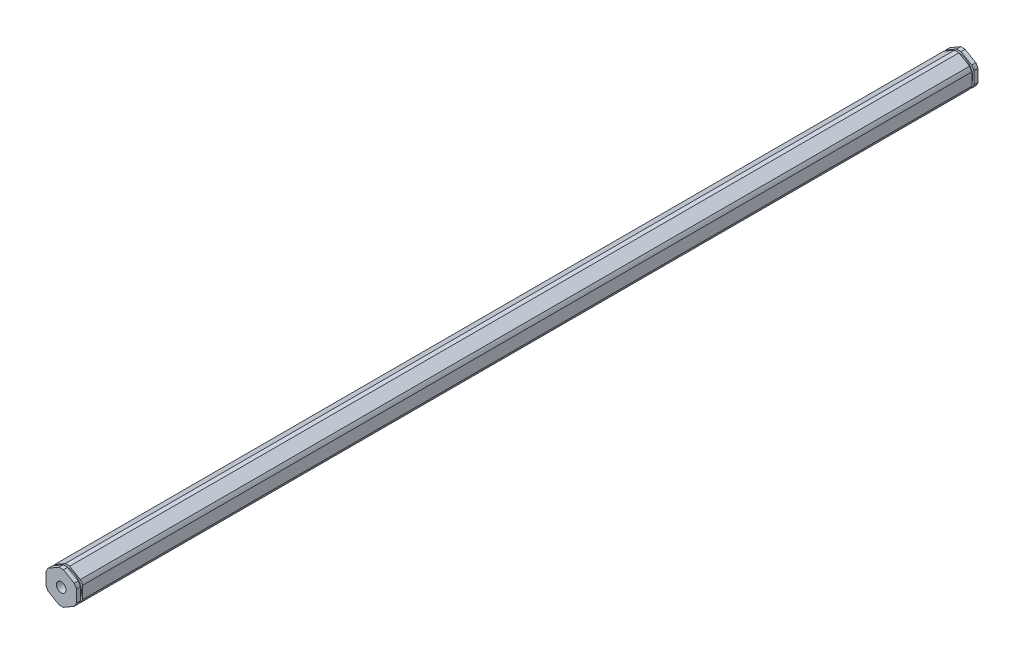
ISO-10303-21;
HEADER;
FILE_DESCRIPTION(('STEP AP214'),'2;1');
FILE_NAME('part.step','',(''),(''),'','','');
FILE_SCHEMA(('AUTOMOTIVE_DESIGN { 1 0 10303 214 1 1 1 1 }'));
ENDSEC;
DATA;
#1=APPLICATION_CONTEXT('core data for automotive mechanical design processes');
#2=APPLICATION_PROTOCOL_DEFINITION('international standard','automotive_design',2000,#1);
#3=PRODUCT_CONTEXT('',#1,'mechanical');
#4=PRODUCT('Part','Part','',(#3));
#5=PRODUCT_RELATED_PRODUCT_CATEGORY('part','',(#4));
#6=PRODUCT_DEFINITION_FORMATION('','',#4);
#7=PRODUCT_DEFINITION_CONTEXT('part definition',#1,'design');
#8=PRODUCT_DEFINITION('design','',#6,#7);
#9=PRODUCT_DEFINITION_SHAPE('','',#8);
#10=(LENGTH_UNIT() NAMED_UNIT(*) SI_UNIT(.MILLI.,.METRE.));
#11=(NAMED_UNIT(*) PLANE_ANGLE_UNIT() SI_UNIT($,.RADIAN.));
#12=(NAMED_UNIT(*) SI_UNIT($,.STERADIAN.) SOLID_ANGLE_UNIT());
#13=UNCERTAINTY_MEASURE_WITH_UNIT(LENGTH_MEASURE(1.E-05),#10,'distance_accuracy_value','');
#14=(GEOMETRIC_REPRESENTATION_CONTEXT(3) GLOBAL_UNCERTAINTY_ASSIGNED_CONTEXT((#13)) GLOBAL_UNIT_ASSIGNED_CONTEXT((#10,
#11,#12)) REPRESENTATION_CONTEXT('',''));
#15=CARTESIAN_POINT('',(0.,0.,0.));
#16=DIRECTION('',(0.,0.,1.));
#17=DIRECTION('',(1.,0.,0.));
#18=AXIS2_PLACEMENT_3D('',#15,#16,#17);
#19=CARTESIAN_POINT('',(0.,0.,188.4045));
#20=DIRECTION('',(0.,0.,-1.));
#21=DIRECTION('',(-1.,0.,0.));
#22=AXIS2_PLACEMENT_3D('',#19,#20,#21);
#23=CYLINDRICAL_SURFACE('',#22,6.858);
#24=CARTESIAN_POINT('',(0.,0.,-185.801));
#25=DIRECTION('',(0.,0.,1.));
#26=DIRECTION('',(1.,0.,0.));
#27=AXIS2_PLACEMENT_3D('',#24,#25,#26);
#28=CIRCLE('',#27,6.858);
#29=CARTESIAN_POINT('',(5.41826726004728,-4.20411035757861,-185.801));
#30=VERTEX_POINT('',#29);
#31=CARTESIAN_POINT('',(6.35,-2.59030191290513,-185.801));
#32=VERTEX_POINT('',#31);
#33=EDGE_CURVE('E309',#30,#32,#28,.T.);
#34=ORIENTED_EDGE('',*,*,#33,.T.);
#35=DIRECTION('',(0.,0.,-1.));
#36=VECTOR('',#35,1.);
#37=CARTESIAN_POINT('',(6.35,-2.59030191290513,188.4045));
#38=LINE('',#37,#36);
#39=CARTESIAN_POINT('',(6.35,-2.59030191290513,185.801));
#40=VERTEX_POINT('',#39);
#41=EDGE_CURVE('E351',#40,#32,#38,.T.);
#42=ORIENTED_EDGE('',*,*,#41,.F.);
#43=CARTESIAN_POINT('',(0.,0.,185.801));
#44=DIRECTION('',(0.,0.,1.));
#45=DIRECTION('',(1.,0.,0.));
#46=AXIS2_PLACEMENT_3D('',#43,#44,#45);
#47=CIRCLE('',#46,6.858);
#48=CARTESIAN_POINT('',(5.41826726004727,-4.20411035757862,185.801));
#49=VERTEX_POINT('',#48);
#50=EDGE_CURVE('E330',#49,#40,#47,.T.);
#51=ORIENTED_EDGE('',*,*,#50,.F.);
#52=DIRECTION('',(0.,0.,-1.));
#53=VECTOR('',#52,1.);
#54=CARTESIAN_POINT('',(5.41826726004727,-4.20411035757862,188.4045));
#55=LINE('',#54,#53);
#56=EDGE_CURVE('E353',#49,#30,#55,.T.);
#57=ORIENTED_EDGE('',*,*,#56,.T.);
#58=EDGE_LOOP('',(#34,#42,#51,#57));
#59=FACE_BOUND('',#58,.T.);
#60=ADVANCED_FACE('F58',(#59),#23,.T.);
#61=CARTESIAN_POINT('',(3.175,-5.49926131403118,188.4045));
#62=DIRECTION('',(-0.5,0.866025403784438,0.));
#63=DIRECTION('',(-0.866025403784439,-0.5,0.));
#64=AXIS2_PLACEMENT_3D('',#61,#62,#63);
#65=PLANE('',#64);
#66=DIRECTION('',(-0.866025403784439,-0.5,0.));
#67=VECTOR('',#66,1.);
#68=CARTESIAN_POINT('',(3.175,-5.49926131403118,-185.801));
#69=LINE('',#68,#67);
#70=CARTESIAN_POINT('',(0.931732739952731,-6.79441227048375,-185.801));
#71=VERTEX_POINT('',#70);
#72=EDGE_CURVE('E611',#30,#71,#69,.T.);
#73=ORIENTED_EDGE('',*,*,#72,.F.);
#74=ORIENTED_EDGE('',*,*,#56,.F.);
#75=DIRECTION('',(0.866025403784439,0.5,0.));
#76=VECTOR('',#75,1.);
#77=CARTESIAN_POINT('',(3.175,-5.49926131403118,185.801));
#78=LINE('',#77,#76);
#79=CARTESIAN_POINT('',(0.931732739952722,-6.79441227048375,185.801));
#80=VERTEX_POINT('',#79);
#81=EDGE_CURVE('E575',#80,#49,#78,.T.);
#82=ORIENTED_EDGE('',*,*,#81,.F.);
#83=DIRECTION('',(0.,0.,-1.));
#84=VECTOR('',#83,1.);
#85=CARTESIAN_POINT('',(0.931732739952731,-6.79441227048375,188.4045));
#86=LINE('',#85,#84);
#87=EDGE_CURVE('E382',#80,#71,#86,.T.);
#88=ORIENTED_EDGE('',*,*,#87,.T.);
#89=EDGE_LOOP('',(#73,#74,#82,#88));
#90=FACE_BOUND('',#89,.T.);
#91=ADVANCED_FACE('F669',(#90),#65,.F.);
#92=CARTESIAN_POINT('',(-0.931732739952718,-6.79441227048376,-185.801));
#93=VERTEX_POINT('',#92);
#94=EDGE_CURVE('E355',#93,#71,#28,.T.);
#95=ORIENTED_EDGE('',*,*,#94,.T.);
#96=ORIENTED_EDGE('',*,*,#87,.F.);
#97=CARTESIAN_POINT('',(0.,0.,185.801));
#98=DIRECTION('',(0.,0.,1.));
#99=DIRECTION('',(1.,0.,0.));
#100=AXIS2_PLACEMENT_3D('',#97,#98,#99);
#101=CIRCLE('',#100,6.858);
#102=CARTESIAN_POINT('',(-0.931732739952721,-6.79441227048375,185.801));
#103=VERTEX_POINT('',#102);
#104=EDGE_CURVE('E590',#103,#80,#101,.T.);
#105=ORIENTED_EDGE('',*,*,#104,.F.);
#106=DIRECTION('',(0.,0.,-1.));
#107=VECTOR('',#106,1.);
#108=CARTESIAN_POINT('',(-0.931732739952721,-6.79441227048375,188.4045));
#109=LINE('',#108,#107);
#110=EDGE_CURVE('E388',#103,#93,#109,.T.);
#111=ORIENTED_EDGE('',*,*,#110,.T.);
#112=EDGE_LOOP('',(#95,#96,#105,#111));
#113=FACE_BOUND('',#112,.T.);
#114=ADVANCED_FACE('F663',(#113),#23,.T.);
#115=CARTESIAN_POINT('',(-3.175,-5.49926131403118,188.4045));
#116=DIRECTION('',(0.5,0.866025403784439,0.));
#117=DIRECTION('',(-0.866025403784439,0.5,0.));
#118=AXIS2_PLACEMENT_3D('',#115,#116,#117);
#119=PLANE('',#118);
#120=DIRECTION('',(-0.866025403784439,0.5,0.));
#121=VECTOR('',#120,1.);
#122=CARTESIAN_POINT('',(-3.175,-5.49926131403118,-185.801));
#123=LINE('',#122,#121);
#124=CARTESIAN_POINT('',(-5.41826726004728,-4.20411035757862,-185.801));
#125=VERTEX_POINT('',#124);
#126=EDGE_CURVE('E614',#93,#125,#123,.T.);
#127=ORIENTED_EDGE('',*,*,#126,.F.);
#128=ORIENTED_EDGE('',*,*,#110,.F.);
#129=DIRECTION('',(0.866025403784439,-0.5,0.));
#130=VECTOR('',#129,1.);
#131=CARTESIAN_POINT('',(-3.175,-5.49926131403118,185.801));
#132=LINE('',#131,#130);
#133=CARTESIAN_POINT('',(-5.41826726004728,-4.20411035757861,185.801));
#134=VERTEX_POINT('',#133);
#135=EDGE_CURVE('E572',#134,#103,#132,.T.);
#136=ORIENTED_EDGE('',*,*,#135,.F.);
#137=DIRECTION('',(0.,0.,-1.));
#138=VECTOR('',#137,1.);
#139=CARTESIAN_POINT('',(-5.41826726004728,-4.20411035757862,188.4045));
#140=LINE('',#139,#138);
#141=EDGE_CURVE('E394',#134,#125,#140,.T.);
#142=ORIENTED_EDGE('',*,*,#141,.T.);
#143=EDGE_LOOP('',(#127,#128,#136,#142));
#144=FACE_BOUND('',#143,.T.);
#145=ADVANCED_FACE('F725',(#144),#119,.F.);
#146=CARTESIAN_POINT('',(-6.35,-2.59030191290514,-185.801));
#147=VERTEX_POINT('',#146);
#148=EDGE_CURVE('E646',#147,#125,#28,.T.);
#149=ORIENTED_EDGE('',*,*,#148,.T.);
#150=ORIENTED_EDGE('',*,*,#141,.F.);
#151=CARTESIAN_POINT('',(-6.35,-2.59030191290514,185.801));
#152=VERTEX_POINT('',#151);
#153=EDGE_CURVE('E718',#152,#134,#101,.T.);
#154=ORIENTED_EDGE('',*,*,#153,.F.);
#155=DIRECTION('',(0.,0.,-1.));
#156=VECTOR('',#155,1.);
#157=CARTESIAN_POINT('',(-6.35,-2.59030191290514,188.4045));
#158=LINE('',#157,#156);
#159=EDGE_CURVE('E400',#152,#147,#158,.T.);
#160=ORIENTED_EDGE('',*,*,#159,.T.);
#161=EDGE_LOOP('',(#149,#150,#154,#160));
#162=FACE_BOUND('',#161,.T.);
#163=ADVANCED_FACE('F717',(#162),#23,.T.);
#164=CARTESIAN_POINT('',(-6.35,0.,188.4045));
#165=DIRECTION('',(1.,0.,0.));
#166=DIRECTION('',(0.,1.,0.));
#167=AXIS2_PLACEMENT_3D('',#164,#165,#166);
#168=PLANE('',#167);
#169=DIRECTION('',(0.,1.,0.));
#170=VECTOR('',#169,1.);
#171=CARTESIAN_POINT('',(-6.35,0.,-185.801));
#172=LINE('',#171,#170);
#173=CARTESIAN_POINT('',(-6.35,2.59030191290514,-185.801));
#174=VERTEX_POINT('',#173);
#175=EDGE_CURVE('E617',#147,#174,#172,.T.);
#176=ORIENTED_EDGE('',*,*,#175,.F.);
#177=ORIENTED_EDGE('',*,*,#159,.F.);
#178=DIRECTION('',(0.,-1.,0.));
#179=VECTOR('',#178,1.);
#180=CARTESIAN_POINT('',(-6.35,0.,185.801));
#181=LINE('',#180,#179);
#182=CARTESIAN_POINT('',(-6.35,2.59030191290514,185.801));
#183=VERTEX_POINT('',#182);
#184=EDGE_CURVE('E569',#183,#152,#181,.T.);
#185=ORIENTED_EDGE('',*,*,#184,.F.);
#186=DIRECTION('',(0.,0.,-1.));
#187=VECTOR('',#186,1.);
#188=CARTESIAN_POINT('',(-6.35,2.59030191290514,188.4045));
#189=LINE('',#188,#187);
#190=EDGE_CURVE('E406',#183,#174,#189,.T.);
#191=ORIENTED_EDGE('',*,*,#190,.T.);
#192=EDGE_LOOP('',(#176,#177,#185,#191));
#193=FACE_BOUND('',#192,.T.);
#194=ADVANCED_FACE('F714',(#193),#168,.F.);
#195=CARTESIAN_POINT('',(-5.41826726004727,4.20411035757862,-185.801));
#196=VERTEX_POINT('',#195);
#197=EDGE_CURVE('E640',#196,#174,#28,.T.);
#198=ORIENTED_EDGE('',*,*,#197,.T.);
#199=ORIENTED_EDGE('',*,*,#190,.F.);
#200=CARTESIAN_POINT('',(-5.41826726004727,4.20411035757862,185.801));
#201=VERTEX_POINT('',#200);
#202=EDGE_CURVE('E706',#201,#183,#101,.T.);
#203=ORIENTED_EDGE('',*,*,#202,.F.);
#204=DIRECTION('',(0.,0.,-1.));
#205=VECTOR('',#204,1.);
#206=CARTESIAN_POINT('',(-5.41826726004727,4.20411035757862,188.4045));
#207=LINE('',#206,#205);
#208=EDGE_CURVE('E412',#201,#196,#207,.T.);
#209=ORIENTED_EDGE('',*,*,#208,.T.);
#210=EDGE_LOOP('',(#198,#199,#203,#209));
#211=FACE_BOUND('',#210,.T.);
#212=ADVANCED_FACE('F823',(#211),#23,.T.);
#213=CARTESIAN_POINT('',(-3.175,5.49926131403119,188.4045));
#214=DIRECTION('',(0.5,-0.866025403784438,0.));
#215=DIRECTION('',(0.866025403784439,0.5,0.));
#216=AXIS2_PLACEMENT_3D('',#213,#214,#215);
#217=PLANE('',#216);
#218=DIRECTION('',(0.866025403784439,0.5,0.));
#219=VECTOR('',#218,1.);
#220=CARTESIAN_POINT('',(-3.175,5.49926131403119,-185.801));
#221=LINE('',#220,#219);
#222=CARTESIAN_POINT('',(-0.931732739952731,6.79441227048375,-185.801));
#223=VERTEX_POINT('',#222);
#224=EDGE_CURVE('E620',#196,#223,#221,.T.);
#225=ORIENTED_EDGE('',*,*,#224,.F.);
#226=ORIENTED_EDGE('',*,*,#208,.F.);
#227=DIRECTION('',(-0.866025403784439,-0.5,0.));
#228=VECTOR('',#227,1.);
#229=CARTESIAN_POINT('',(-3.175,5.49926131403119,185.801));
#230=LINE('',#229,#228);
#231=CARTESIAN_POINT('',(-0.931732739952728,6.79441227048375,185.801));
#232=VERTEX_POINT('',#231);
#233=EDGE_CURVE('E566',#232,#201,#230,.T.);
#234=ORIENTED_EDGE('',*,*,#233,.F.);
#235=DIRECTION('',(0.,0.,-1.));
#236=VECTOR('',#235,1.);
#237=CARTESIAN_POINT('',(-0.931732739952731,6.79441227048375,188.4045));
#238=LINE('',#237,#236);
#239=EDGE_CURVE('E418',#232,#223,#238,.T.);
#240=ORIENTED_EDGE('',*,*,#239,.T.);
#241=EDGE_LOOP('',(#225,#226,#234,#240));
#242=FACE_BOUND('',#241,.T.);
#243=ADVANCED_FACE('F700',(#242),#217,.F.);
#244=CARTESIAN_POINT('',(0.931732739952728,6.79441227048375,-185.801));
#245=VERTEX_POINT('',#244);
#246=EDGE_CURVE('E634',#245,#223,#28,.T.);
#247=ORIENTED_EDGE('',*,*,#246,.T.);
#248=ORIENTED_EDGE('',*,*,#239,.F.);
#249=CARTESIAN_POINT('',(0.931732739952733,6.79441227048375,185.801));
#250=VERTEX_POINT('',#249);
#251=EDGE_CURVE('E589',#250,#232,#101,.T.);
#252=ORIENTED_EDGE('',*,*,#251,.F.);
#253=DIRECTION('',(0.,0.,-1.));
#254=VECTOR('',#253,1.);
#255=CARTESIAN_POINT('',(0.931732739952733,6.79441227048375,188.4045));
#256=LINE('',#255,#254);
#257=EDGE_CURVE('E422',#250,#245,#256,.T.);
#258=ORIENTED_EDGE('',*,*,#257,.T.);
#259=EDGE_LOOP('',(#247,#248,#252,#258));
#260=FACE_BOUND('',#259,.T.);
#261=ADVANCED_FACE('F703',(#260),#23,.T.);
#262=CARTESIAN_POINT('',(3.175,5.49926131403119,188.4045));
#263=DIRECTION('',(-0.5,-0.866025403784438,0.));
#264=DIRECTION('',(0.866025403784439,-0.5,0.));
#265=AXIS2_PLACEMENT_3D('',#262,#263,#264);
#266=PLANE('',#265);
#267=DIRECTION('',(0.866025403784439,-0.5,0.));
#268=VECTOR('',#267,1.);
#269=CARTESIAN_POINT('',(3.175,5.49926131403119,-185.801));
#270=LINE('',#269,#268);
#271=CARTESIAN_POINT('',(5.41826726004727,4.20411035757862,-185.801));
#272=VERTEX_POINT('',#271);
#273=EDGE_CURVE('E623',#245,#272,#270,.T.);
#274=ORIENTED_EDGE('',*,*,#273,.F.);
#275=ORIENTED_EDGE('',*,*,#257,.F.);
#276=DIRECTION('',(-0.866025403784439,0.5,0.));
#277=VECTOR('',#276,1.);
#278=CARTESIAN_POINT('',(3.175,5.49926131403119,185.801));
#279=LINE('',#278,#277);
#280=CARTESIAN_POINT('',(5.41826726004727,4.20411035757862,185.801));
#281=VERTEX_POINT('',#280);
#282=EDGE_CURVE('E563',#281,#250,#279,.T.);
#283=ORIENTED_EDGE('',*,*,#282,.F.);
#284=DIRECTION('',(0.,0.,-1.));
#285=VECTOR('',#284,1.);
#286=CARTESIAN_POINT('',(5.41826726004727,4.20411035757862,188.4045));
#287=LINE('',#286,#285);
#288=EDGE_CURVE('E325',#281,#272,#287,.T.);
#289=ORIENTED_EDGE('',*,*,#288,.T.);
#290=EDGE_LOOP('',(#274,#275,#283,#289));
#291=FACE_BOUND('',#290,.T.);
#292=ADVANCED_FACE('F710',(#291),#266,.F.);
#293=CARTESIAN_POINT('',(6.35,2.59030191290513,-185.801));
#294=VERTEX_POINT('',#293);
#295=EDGE_CURVE('E74',#294,#272,#28,.T.);
#296=ORIENTED_EDGE('',*,*,#295,.T.);
#297=ORIENTED_EDGE('',*,*,#288,.F.);
#298=CARTESIAN_POINT('',(6.35,2.59030191290513,185.801));
#299=VERTEX_POINT('',#298);
#300=EDGE_CURVE('E586',#299,#281,#101,.T.);
#301=ORIENTED_EDGE('',*,*,#300,.F.);
#302=DIRECTION('',(0.,0.,-1.));
#303=VECTOR('',#302,1.);
#304=CARTESIAN_POINT('',(6.35,2.59030191290513,188.4045));
#305=LINE('',#304,#303);
#306=EDGE_CURVE('E317',#299,#294,#305,.T.);
#307=ORIENTED_EDGE('',*,*,#306,.T.);
#308=EDGE_LOOP('',(#296,#297,#301,#307));
#309=FACE_BOUND('',#308,.T.);
#310=ADVANCED_FACE('F806',(#309),#23,.T.);
#311=CARTESIAN_POINT('',(6.35,0.,188.4045));
#312=DIRECTION('',(-1.,0.,0.));
#313=DIRECTION('',(0.,-1.,0.));
#314=AXIS2_PLACEMENT_3D('',#311,#312,#313);
#315=PLANE('',#314);
#316=DIRECTION('',(0.,-1.,0.));
#317=VECTOR('',#316,1.);
#318=CARTESIAN_POINT('',(6.35,0.,-185.801));
#319=LINE('',#318,#317);
#320=EDGE_CURVE('E67',#294,#32,#319,.T.);
#321=ORIENTED_EDGE('',*,*,#320,.F.);
#322=ORIENTED_EDGE('',*,*,#306,.F.);
#323=DIRECTION('',(0.,1.,0.));
#324=VECTOR('',#323,1.);
#325=CARTESIAN_POINT('',(6.35,0.,185.801));
#326=LINE('',#325,#324);
#327=EDGE_CURVE('E358',#40,#299,#326,.T.);
#328=ORIENTED_EDGE('',*,*,#327,.F.);
#329=ORIENTED_EDGE('',*,*,#41,.T.);
#330=EDGE_LOOP('',(#321,#322,#328,#329));
#331=FACE_BOUND('',#330,.T.);
#332=ADVANCED_FACE('F357',(#331),#315,.F.);
#333=DIRECTION('',(0.,-1.,0.));
#334=VECTOR('',#333,1.);
#335=CARTESIAN_POINT('',(6.35,0.,186.69));
#336=LINE('',#335,#334);
#337=CARTESIAN_POINT('',(6.35,2.59030191290513,186.69));
#338=VERTEX_POINT('',#337);
#339=CARTESIAN_POINT('',(6.35,-2.59030191290513,186.69));
#340=VERTEX_POINT('',#339);
#341=EDGE_CURVE('E543',#338,#340,#336,.T.);
#342=ORIENTED_EDGE('',*,*,#341,.F.);
#343=CARTESIAN_POINT('',(6.35,2.59030191290513,188.4045));
#344=VERTEX_POINT('',#343);
#345=EDGE_CURVE('E320',#344,#338,#305,.T.);
#346=ORIENTED_EDGE('',*,*,#345,.F.);
#347=DIRECTION('',(0.,1.,0.));
#348=VECTOR('',#347,1.);
#349=CARTESIAN_POINT('',(6.35,0.,188.4045));
#350=LINE('',#349,#348);
#351=CARTESIAN_POINT('',(6.35,-2.59030191290513,188.4045));
#352=VERTEX_POINT('',#351);
#353=EDGE_CURVE('E491',#352,#344,#350,.T.);
#354=ORIENTED_EDGE('',*,*,#353,.F.);
#355=EDGE_CURVE('E360',#352,#340,#38,.T.);
#356=ORIENTED_EDGE('',*,*,#355,.T.);
#357=EDGE_LOOP('',(#342,#346,#354,#356));
#358=FACE_BOUND('',#357,.T.);
#359=ADVANCED_FACE('F60',(#358),#315,.F.);
#360=CARTESIAN_POINT('',(0.,0.,186.69));
#361=DIRECTION('',(0.,0.,1.));
#362=DIRECTION('',(1.,0.,0.));
#363=AXIS2_PLACEMENT_3D('',#360,#361,#362);
#364=CIRCLE('',#363,6.858);
#365=CARTESIAN_POINT('',(5.41826726004727,4.20411035757862,186.69));
#366=VERTEX_POINT('',#365);
#367=EDGE_CURVE('E591',#338,#366,#364,.T.);
#368=ORIENTED_EDGE('',*,*,#367,.T.);
#369=CARTESIAN_POINT('',(5.41826726004727,4.20411035757862,188.4045));
#370=VERTEX_POINT('',#369);
#371=EDGE_CURVE('E318',#370,#366,#287,.T.);
#372=ORIENTED_EDGE('',*,*,#371,.F.);
#373=CARTESIAN_POINT('',(0.,0.,188.4045));
#374=DIRECTION('',(0.,0.,1.));
#375=DIRECTION('',(1.,0.,0.));
#376=AXIS2_PLACEMENT_3D('',#373,#374,#375);
#377=CIRCLE('',#376,6.858);
#378=EDGE_CURVE('E496',#344,#370,#377,.T.);
#379=ORIENTED_EDGE('',*,*,#378,.F.);
#380=ORIENTED_EDGE('',*,*,#345,.T.);
#381=EDGE_LOOP('',(#368,#372,#379,#380));
#382=FACE_BOUND('',#381,.T.);
#383=ADVANCED_FACE('F750',(#382),#23,.T.);
#384=DIRECTION('',(0.866025403784439,-0.5,0.));
#385=VECTOR('',#384,1.);
#386=CARTESIAN_POINT('',(3.175,5.49926131403119,186.69));
#387=LINE('',#386,#385);
#388=CARTESIAN_POINT('',(0.931732739952733,6.79441227048375,186.69));
#389=VERTEX_POINT('',#388);
#390=EDGE_CURVE('E546',#389,#366,#387,.T.);
#391=ORIENTED_EDGE('',*,*,#390,.F.);
#392=CARTESIAN_POINT('',(0.931732739952733,6.79441227048375,188.4045));
#393=VERTEX_POINT('',#392);
#394=EDGE_CURVE('E419',#393,#389,#256,.T.);
#395=ORIENTED_EDGE('',*,*,#394,.F.);
#396=DIRECTION('',(-0.866025403784439,0.5,0.));
#397=VECTOR('',#396,1.);
#398=CARTESIAN_POINT('',(3.175,5.49926131403119,188.4045));
#399=LINE('',#398,#397);
#400=EDGE_CURVE('E501',#370,#393,#399,.T.);
#401=ORIENTED_EDGE('',*,*,#400,.F.);
#402=ORIENTED_EDGE('',*,*,#371,.T.);
#403=EDGE_LOOP('',(#391,#395,#401,#402));
#404=FACE_BOUND('',#403,.T.);
#405=ADVANCED_FACE('F758',(#404),#266,.F.);
#406=CARTESIAN_POINT('',(-0.931732739952728,6.79441227048375,186.69));
#407=VERTEX_POINT('',#406);
#408=EDGE_CURVE('E594',#389,#407,#364,.T.);
#409=ORIENTED_EDGE('',*,*,#408,.T.);
#410=CARTESIAN_POINT('',(-0.931732739952731,6.79441227048375,188.4045));
#411=VERTEX_POINT('',#410);
#412=EDGE_CURVE('E413',#411,#407,#238,.T.);
#413=ORIENTED_EDGE('',*,*,#412,.F.);
#414=EDGE_CURVE('E503',#393,#411,#377,.T.);
#415=ORIENTED_EDGE('',*,*,#414,.F.);
#416=ORIENTED_EDGE('',*,*,#394,.T.);
#417=EDGE_LOOP('',(#409,#413,#415,#416));
#418=FACE_BOUND('',#417,.T.);
#419=ADVANCED_FACE('F764',(#418),#23,.T.);
#420=DIRECTION('',(0.866025403784439,0.5,0.));
#421=VECTOR('',#420,1.);
#422=CARTESIAN_POINT('',(-3.175,5.49926131403119,186.69));
#423=LINE('',#422,#421);
#424=CARTESIAN_POINT('',(-5.41826726004727,4.20411035757862,186.69));
#425=VERTEX_POINT('',#424);
#426=EDGE_CURVE('E549',#425,#407,#423,.T.);
#427=ORIENTED_EDGE('',*,*,#426,.F.);
#428=CARTESIAN_POINT('',(-5.41826726004727,4.20411035757862,188.4045));
#429=VERTEX_POINT('',#428);
#430=EDGE_CURVE('E407',#429,#425,#207,.T.);
#431=ORIENTED_EDGE('',*,*,#430,.F.);
#432=DIRECTION('',(-0.866025403784439,-0.5,0.));
#433=VECTOR('',#432,1.);
#434=CARTESIAN_POINT('',(-3.175,5.49926131403119,188.4045));
#435=LINE('',#434,#433);
#436=EDGE_CURVE('E510',#411,#429,#435,.T.);
#437=ORIENTED_EDGE('',*,*,#436,.F.);
#438=ORIENTED_EDGE('',*,*,#412,.T.);
#439=EDGE_LOOP('',(#427,#431,#437,#438));
#440=FACE_BOUND('',#439,.T.);
#441=ADVANCED_FACE('F796',(#440),#217,.F.);
#442=CARTESIAN_POINT('',(-6.35,2.59030191290514,186.69));
#443=VERTEX_POINT('',#442);
#444=EDGE_CURVE('E1191',#425,#443,#364,.T.);
#445=ORIENTED_EDGE('',*,*,#444,.T.);
#446=CARTESIAN_POINT('',(-6.35,2.59030191290514,188.4045));
#447=VERTEX_POINT('',#446);
#448=EDGE_CURVE('E401',#447,#443,#189,.T.);
#449=ORIENTED_EDGE('',*,*,#448,.F.);
#450=EDGE_CURVE('E513',#429,#447,#377,.T.);
#451=ORIENTED_EDGE('',*,*,#450,.F.);
#452=ORIENTED_EDGE('',*,*,#430,.T.);
#453=EDGE_LOOP('',(#445,#449,#451,#452));
#454=FACE_BOUND('',#453,.T.);
#455=ADVANCED_FACE('F788',(#454),#23,.T.);
#456=DIRECTION('',(0.,1.,0.));
#457=VECTOR('',#456,1.);
#458=CARTESIAN_POINT('',(-6.35,0.,186.69));
#459=LINE('',#458,#457);
#460=CARTESIAN_POINT('',(-6.35,-2.59030191290514,186.69));
#461=VERTEX_POINT('',#460);
#462=EDGE_CURVE('E552',#461,#443,#459,.T.);
#463=ORIENTED_EDGE('',*,*,#462,.F.);
#464=CARTESIAN_POINT('',(-6.35,-2.59030191290514,188.4045));
#465=VERTEX_POINT('',#464);
#466=EDGE_CURVE('E395',#465,#461,#158,.T.);
#467=ORIENTED_EDGE('',*,*,#466,.F.);
#468=DIRECTION('',(0.,-1.,0.));
#469=VECTOR('',#468,1.);
#470=CARTESIAN_POINT('',(-6.35,0.,188.4045));
#471=LINE('',#470,#469);
#472=EDGE_CURVE('E514',#447,#465,#471,.T.);
#473=ORIENTED_EDGE('',*,*,#472,.F.);
#474=ORIENTED_EDGE('',*,*,#448,.T.);
#475=EDGE_LOOP('',(#463,#467,#473,#474));
#476=FACE_BOUND('',#475,.T.);
#477=ADVANCED_FACE('F786',(#476),#168,.F.);
#478=CARTESIAN_POINT('',(-5.41826726004728,-4.20411035757861,186.69));
#479=VERTEX_POINT('',#478);
#480=EDGE_CURVE('E1189',#461,#479,#364,.T.);
#481=ORIENTED_EDGE('',*,*,#480,.T.);
#482=CARTESIAN_POINT('',(-5.41826726004728,-4.20411035757862,188.4045));
#483=VERTEX_POINT('',#482);
#484=EDGE_CURVE('E389',#483,#479,#140,.T.);
#485=ORIENTED_EDGE('',*,*,#484,.F.);
#486=EDGE_CURVE('E517',#465,#483,#377,.T.);
#487=ORIENTED_EDGE('',*,*,#486,.F.);
#488=ORIENTED_EDGE('',*,*,#466,.T.);
#489=EDGE_LOOP('',(#481,#485,#487,#488));
#490=FACE_BOUND('',#489,.T.);
#491=ADVANCED_FACE('F740',(#490),#23,.T.);
#492=DIRECTION('',(-0.866025403784439,0.5,0.));
#493=VECTOR('',#492,1.);
#494=CARTESIAN_POINT('',(-3.175,-5.49926131403118,186.69));
#495=LINE('',#494,#493);
#496=CARTESIAN_POINT('',(-0.931732739952721,-6.79441227048375,186.69));
#497=VERTEX_POINT('',#496);
#498=EDGE_CURVE('E555',#497,#479,#495,.T.);
#499=ORIENTED_EDGE('',*,*,#498,.F.);
#500=CARTESIAN_POINT('',(-0.931732739952721,-6.79441227048375,188.4045));
#501=VERTEX_POINT('',#500);
#502=EDGE_CURVE('E383',#501,#497,#109,.T.);
#503=ORIENTED_EDGE('',*,*,#502,.F.);
#504=DIRECTION('',(0.866025403784439,-0.5,0.));
#505=VECTOR('',#504,1.);
#506=CARTESIAN_POINT('',(-3.175,-5.49926131403118,188.4045));
#507=LINE('',#506,#505);
#508=EDGE_CURVE('E518',#483,#501,#507,.T.);
#509=ORIENTED_EDGE('',*,*,#508,.F.);
#510=ORIENTED_EDGE('',*,*,#484,.T.);
#511=EDGE_LOOP('',(#499,#503,#509,#510));
#512=FACE_BOUND('',#511,.T.);
#513=ADVANCED_FACE('F728',(#512),#119,.F.);
#514=CARTESIAN_POINT('',(0.931732739952722,-6.79441227048375,186.69));
#515=VERTEX_POINT('',#514);
#516=EDGE_CURVE('E595',#497,#515,#364,.T.);
#517=ORIENTED_EDGE('',*,*,#516,.T.);
#518=CARTESIAN_POINT('',(0.931732739952731,-6.79441227048375,188.4045));
#519=VERTEX_POINT('',#518);
#520=EDGE_CURVE('E377',#519,#515,#86,.T.);
#521=ORIENTED_EDGE('',*,*,#520,.F.);
#522=EDGE_CURVE('E521',#501,#519,#377,.T.);
#523=ORIENTED_EDGE('',*,*,#522,.F.);
#524=ORIENTED_EDGE('',*,*,#502,.T.);
#525=EDGE_LOOP('',(#517,#521,#523,#524));
#526=FACE_BOUND('',#525,.T.);
#527=ADVANCED_FACE('F739',(#526),#23,.T.);
#528=DIRECTION('',(-0.866025403784439,-0.5,0.));
#529=VECTOR('',#528,1.);
#530=CARTESIAN_POINT('',(3.175,-5.49926131403118,186.69));
#531=LINE('',#530,#529);
#532=CARTESIAN_POINT('',(5.41826726004727,-4.20411035757862,186.69));
#533=VERTEX_POINT('',#532);
#534=EDGE_CURVE('E558',#533,#515,#531,.T.);
#535=ORIENTED_EDGE('',*,*,#534,.F.);
#536=CARTESIAN_POINT('',(5.41826726004727,-4.20411035757862,188.4045));
#537=VERTEX_POINT('',#536);
#538=EDGE_CURVE('E372',#537,#533,#55,.T.);
#539=ORIENTED_EDGE('',*,*,#538,.F.);
#540=DIRECTION('',(0.866025403784439,0.5,0.));
#541=VECTOR('',#540,1.);
#542=CARTESIAN_POINT('',(3.175,-5.49926131403118,188.4045));
#543=LINE('',#542,#541);
#544=EDGE_CURVE('E522',#519,#537,#543,.T.);
#545=ORIENTED_EDGE('',*,*,#544,.F.);
#546=ORIENTED_EDGE('',*,*,#520,.T.);
#547=EDGE_LOOP('',(#535,#539,#545,#546));
#548=FACE_BOUND('',#547,.T.);
#549=ADVANCED_FACE('F749',(#548),#65,.F.);
#550=CARTESIAN_POINT('',(0.,0.,186.69));
#551=DIRECTION('',(0.,0.,-1.));
#552=DIRECTION('',(-1.,0.,0.));
#553=AXIS2_PLACEMENT_3D('',#550,#551,#552);
#554=CIRCLE('',#553,6.858);
#555=EDGE_CURVE('E335',#340,#533,#554,.T.);
#556=ORIENTED_EDGE('',*,*,#555,.F.);
#557=ORIENTED_EDGE('',*,*,#355,.F.);
#558=EDGE_CURVE('E367',#537,#352,#377,.T.);
#559=ORIENTED_EDGE('',*,*,#558,.F.);
#560=ORIENTED_EDGE('',*,*,#538,.T.);
#561=EDGE_LOOP('',(#556,#557,#559,#560));
#562=FACE_BOUND('',#561,.T.);
#563=ADVANCED_FACE('F759',(#562),#23,.T.);
#564=CARTESIAN_POINT('',(0.,0.,188.4045));
#565=DIRECTION('',(0.,0.,1.));
#566=DIRECTION('',(1.,0.,0.));
#567=AXIS2_PLACEMENT_3D('',#564,#565,#566);
#568=PLANE('',#567);
#569=CARTESIAN_POINT('',(0.,0.,188.4045));
#570=DIRECTION('',(0.,0.,1.));
#571=DIRECTION('',(1.,0.,0.));
#572=AXIS2_PLACEMENT_3D('',#569,#570,#571);
#573=CIRCLE('',#572,2.01929999999999);
#574=CARTESIAN_POINT('',(2.01929999999999,0.,188.4045));
#575=VERTEX_POINT('',#574);
#576=EDGE_CURVE('E537',#575,#575,#573,.T.);
#577=ORIENTED_EDGE('',*,*,#576,.F.);
#578=EDGE_LOOP('',(#577));
#579=FACE_BOUND('',#578,.T.);
#580=ORIENTED_EDGE('',*,*,#353,.T.);
#581=ORIENTED_EDGE('',*,*,#378,.T.);
#582=ORIENTED_EDGE('',*,*,#400,.T.);
#583=ORIENTED_EDGE('',*,*,#414,.T.);
#584=ORIENTED_EDGE('',*,*,#436,.T.);
#585=ORIENTED_EDGE('',*,*,#450,.T.);
#586=ORIENTED_EDGE('',*,*,#472,.T.);
#587=ORIENTED_EDGE('',*,*,#486,.T.);
#588=ORIENTED_EDGE('',*,*,#508,.T.);
#589=ORIENTED_EDGE('',*,*,#522,.T.);
#590=ORIENTED_EDGE('',*,*,#544,.T.);
#591=ORIENTED_EDGE('',*,*,#558,.T.);
#592=EDGE_LOOP('',(#580,#581,#582,#583,#584,#585,#586,#587,#588,#589,#590,#591));
#593=FACE_BOUND('',#592,.T.);
#594=ADVANCED_FACE('F768',(#579,#593),#568,.T.);
#595=CARTESIAN_POINT('',(0.,0.,172.05706));
#596=DIRECTION('',(0.,0.,1.));
#597=DIRECTION('',(1.,0.,0.));
#598=AXIS2_PLACEMENT_3D('',#595,#596,#597);
#599=CONICAL_SURFACE('',#598,2.01929999999999,1.02974425867665);
#600=CARTESIAN_POINT('',(0.,0.,170.843742151998));
#601=VERTEX_POINT('',#600);
#602=VERTEX_LOOP('',#601);
#603=FACE_BOUND('',#602,.T.);
#604=CARTESIAN_POINT('',(0.,0.,172.05706));
#605=DIRECTION('',(0.,0.,1.));
#606=DIRECTION('',(1.,0.,0.));
#607=AXIS2_PLACEMENT_3D('',#604,#605,#606);
#608=CIRCLE('',#607,2.01929999999999);
#609=CARTESIAN_POINT('',(2.01929999999999,0.,172.05706));
#610=VERTEX_POINT('',#609);
#611=EDGE_CURVE('E532',#610,#610,#608,.T.);
#612=ORIENTED_EDGE('',*,*,#611,.T.);
#613=EDGE_LOOP('',(#612));
#614=FACE_BOUND('',#613,.T.);
#615=ADVANCED_FACE('F775',(#603,#614),#599,.F.);
#616=CARTESIAN_POINT('',(0.,0.,188.4045));
#617=DIRECTION('',(0.,0.,1.));
#618=DIRECTION('',(1.,0.,0.));
#619=AXIS2_PLACEMENT_3D('',#616,#617,#618);
#620=CYLINDRICAL_SURFACE('',#619,2.01929999999999);
#621=ORIENTED_EDGE('',*,*,#611,.F.);
#622=EDGE_LOOP('',(#621));
#623=FACE_BOUND('',#622,.T.);
#624=ORIENTED_EDGE('',*,*,#576,.T.);
#625=EDGE_LOOP('',(#624));
#626=FACE_BOUND('',#625,.T.);
#627=ADVANCED_FACE('F1029',(#623,#626),#620,.F.);
#628=CARTESIAN_POINT('',(0.,6.858,186.69));
#629=DIRECTION('',(0.,0.,-1.));
#630=DIRECTION('',(-1.,0.,0.));
#631=AXIS2_PLACEMENT_3D('',#628,#629,#630);
#632=PLANE('',#631);
#633=CARTESIAN_POINT('',(0.,0.,186.69));
#634=DIRECTION('',(0.,0.,1.));
#635=DIRECTION('',(1.,0.,0.));
#636=AXIS2_PLACEMENT_3D('',#633,#634,#635);
#637=CIRCLE('',#636,5.8547);
#638=CARTESIAN_POINT('',(5.8547,0.,186.69));
#639=VERTEX_POINT('',#638);
#640=EDGE_CURVE('E578',#639,#639,#637,.T.);
#641=ORIENTED_EDGE('',*,*,#640,.T.);
#642=EDGE_LOOP('',(#641));
#643=FACE_BOUND('',#642,.T.);
#644=ORIENTED_EDGE('',*,*,#341,.T.);
#645=ORIENTED_EDGE('',*,*,#555,.T.);
#646=ORIENTED_EDGE('',*,*,#534,.T.);
#647=ORIENTED_EDGE('',*,*,#516,.F.);
#648=ORIENTED_EDGE('',*,*,#498,.T.);
#649=ORIENTED_EDGE('',*,*,#480,.F.);
#650=ORIENTED_EDGE('',*,*,#462,.T.);
#651=ORIENTED_EDGE('',*,*,#444,.F.);
#652=ORIENTED_EDGE('',*,*,#426,.T.);
#653=ORIENTED_EDGE('',*,*,#408,.F.);
#654=ORIENTED_EDGE('',*,*,#390,.T.);
#655=ORIENTED_EDGE('',*,*,#367,.F.);
#656=EDGE_LOOP('',(#644,#645,#646,#647,#648,#649,#650,#651,#652,#653,#654,#655));
#657=FACE_BOUND('',#656,.T.);
#658=ADVANCED_FACE('F1020',(#643,#657),#632,.T.);
#659=CARTESIAN_POINT('',(0.,6.858,185.801));
#660=DIRECTION('',(0.,0.,1.));
#661=DIRECTION('',(1.,0.,0.));
#662=AXIS2_PLACEMENT_3D('',#659,#660,#661);
#663=PLANE('',#662);
#664=CARTESIAN_POINT('',(0.,0.,185.801));
#665=DIRECTION('',(0.,0.,1.));
#666=DIRECTION('',(1.,0.,0.));
#667=AXIS2_PLACEMENT_3D('',#664,#665,#666);
#668=CIRCLE('',#667,5.8547);
#669=CARTESIAN_POINT('',(5.8547,0.,185.801));
#670=VERTEX_POINT('',#669);
#671=EDGE_CURVE('E582',#670,#670,#668,.T.);
#672=ORIENTED_EDGE('',*,*,#671,.F.);
#673=EDGE_LOOP('',(#672));
#674=FACE_BOUND('',#673,.T.);
#675=ORIENTED_EDGE('',*,*,#327,.T.);
#676=ORIENTED_EDGE('',*,*,#300,.T.);
#677=ORIENTED_EDGE('',*,*,#282,.T.);
#678=ORIENTED_EDGE('',*,*,#251,.T.);
#679=ORIENTED_EDGE('',*,*,#233,.T.);
#680=ORIENTED_EDGE('',*,*,#202,.T.);
#681=ORIENTED_EDGE('',*,*,#184,.T.);
#682=ORIENTED_EDGE('',*,*,#153,.T.);
#683=ORIENTED_EDGE('',*,*,#135,.T.);
#684=ORIENTED_EDGE('',*,*,#104,.T.);
#685=ORIENTED_EDGE('',*,*,#81,.T.);
#686=ORIENTED_EDGE('',*,*,#50,.T.);
#687=EDGE_LOOP('',(#675,#676,#677,#678,#679,#680,#681,#682,#683,#684,#685,#686));
#688=FACE_BOUND('',#687,.T.);
#689=ADVANCED_FACE('F723',(#674,#688),#663,.T.);
#690=CARTESIAN_POINT('',(0.,0.,175.157387884539));
#691=DIRECTION('',(0.,0.,1.));
#692=DIRECTION('',(1.,0.,0.));
#693=AXIS2_PLACEMENT_3D('',#690,#691,#692);
#694=CYLINDRICAL_SURFACE('',#693,5.8547);
#695=ORIENTED_EDGE('',*,*,#671,.T.);
#696=EDGE_LOOP('',(#695));
#697=FACE_BOUND('',#696,.T.);
#698=ORIENTED_EDGE('',*,*,#640,.F.);
#699=EDGE_LOOP('',(#698));
#700=FACE_BOUND('',#699,.T.);
#701=ADVANCED_FACE('F893',(#697,#700),#694,.T.);
#702=CARTESIAN_POINT('',(0.,6.858,-186.69));
#703=DIRECTION('',(0.,0.,1.));
#704=DIRECTION('',(-1.,0.,0.));
#705=AXIS2_PLACEMENT_3D('',#702,#703,#704);
#706=PLANE('',#705);
#707=CARTESIAN_POINT('',(0.,0.,-186.69));
#708=DIRECTION('',(0.,0.,1.));
#709=DIRECTION('',(1.,0.,0.));
#710=AXIS2_PLACEMENT_3D('',#707,#708,#709);
#711=CIRCLE('',#710,5.8547);
#712=CARTESIAN_POINT('',(5.8547,0.,-186.69));
#713=VERTEX_POINT('',#712);
#714=EDGE_CURVE('E626',#713,#713,#711,.T.);
#715=ORIENTED_EDGE('',*,*,#714,.F.);
#716=EDGE_LOOP('',(#715));
#717=FACE_BOUND('',#716,.T.);
#718=DIRECTION('',(0.866025403784439,0.5,0.));
#719=VECTOR('',#718,1.);
#720=CARTESIAN_POINT('',(3.175,-5.49926131403118,-186.69));
#721=LINE('',#720,#719);
#722=CARTESIAN_POINT('',(0.931732739952731,-6.79441227048375,-186.69));
#723=VERTEX_POINT('',#722);
#724=CARTESIAN_POINT('',(5.41826726004728,-4.20411035757861,-186.69));
#725=VERTEX_POINT('',#724);
#726=EDGE_CURVE('E596',#723,#725,#721,.T.);
#727=ORIENTED_EDGE('',*,*,#726,.T.);
#728=CARTESIAN_POINT('',(0.,0.,-186.69));
#729=DIRECTION('',(0.,0.,1.));
#730=DIRECTION('',(1.,0.,0.));
#731=AXIS2_PLACEMENT_3D('',#728,#729,#730);
#732=CIRCLE('',#731,6.858);
#733=CARTESIAN_POINT('',(6.35,-2.59030191290513,-186.69));
#734=VERTEX_POINT('',#733);
#735=EDGE_CURVE('E81',#725,#734,#732,.T.);
#736=ORIENTED_EDGE('',*,*,#735,.T.);
#737=DIRECTION('',(0.,1.,0.));
#738=VECTOR('',#737,1.);
#739=CARTESIAN_POINT('',(6.35,0.,-186.69));
#740=LINE('',#739,#738);
#741=CARTESIAN_POINT('',(6.35,2.59030191290513,-186.69));
#742=VERTEX_POINT('',#741);
#743=EDGE_CURVE('E11',#734,#742,#740,.T.);
#744=ORIENTED_EDGE('',*,*,#743,.T.);
#745=CARTESIAN_POINT('',(5.41826726004727,4.20411035757862,-186.69));
#746=VERTEX_POINT('',#745);
#747=EDGE_CURVE('E296',#742,#746,#732,.T.);
#748=ORIENTED_EDGE('',*,*,#747,.T.);
#749=DIRECTION('',(-0.866025403784439,0.5,0.));
#750=VECTOR('',#749,1.);
#751=CARTESIAN_POINT('',(3.175,5.49926131403119,-186.69));
#752=LINE('',#751,#750);
#753=CARTESIAN_POINT('',(0.931732739952728,6.79441227048375,-186.69));
#754=VERTEX_POINT('',#753);
#755=EDGE_CURVE('E608',#746,#754,#752,.T.);
#756=ORIENTED_EDGE('',*,*,#755,.T.);
#757=CARTESIAN_POINT('',(-0.931732739952731,6.79441227048375,-186.69));
#758=VERTEX_POINT('',#757);
#759=EDGE_CURVE('E310',#754,#758,#732,.T.);
#760=ORIENTED_EDGE('',*,*,#759,.T.);
#761=DIRECTION('',(-0.866025403784439,-0.5,0.));
#762=VECTOR('',#761,1.);
#763=CARTESIAN_POINT('',(-3.175,5.49926131403119,-186.69));
#764=LINE('',#763,#762);
#765=CARTESIAN_POINT('',(-5.41826726004727,4.20411035757862,-186.69));
#766=VERTEX_POINT('',#765);
#767=EDGE_CURVE('E605',#758,#766,#764,.T.);
#768=ORIENTED_EDGE('',*,*,#767,.T.);
#769=CARTESIAN_POINT('',(-6.35,2.59030191290514,-186.69));
#770=VERTEX_POINT('',#769);
#771=EDGE_CURVE('E839',#766,#770,#732,.T.);
#772=ORIENTED_EDGE('',*,*,#771,.T.);
#773=DIRECTION('',(0.,-1.,0.));
#774=VECTOR('',#773,1.);
#775=CARTESIAN_POINT('',(-6.35,0.,-186.69));
#776=LINE('',#775,#774);
#777=CARTESIAN_POINT('',(-6.35,-2.59030191290514,-186.69));
#778=VERTEX_POINT('',#777);
#779=EDGE_CURVE('E602',#770,#778,#776,.T.);
#780=ORIENTED_EDGE('',*,*,#779,.T.);
#781=CARTESIAN_POINT('',(-5.41826726004728,-4.20411035757862,-186.69));
#782=VERTEX_POINT('',#781);
#783=EDGE_CURVE('E681',#778,#782,#732,.T.);
#784=ORIENTED_EDGE('',*,*,#783,.T.);
#785=DIRECTION('',(0.866025403784439,-0.5,0.));
#786=VECTOR('',#785,1.);
#787=CARTESIAN_POINT('',(-3.175,-5.49926131403118,-186.69));
#788=LINE('',#787,#786);
#789=CARTESIAN_POINT('',(-0.931732739952718,-6.79441227048376,-186.69));
#790=VERTEX_POINT('',#789);
#791=EDGE_CURVE('E599',#782,#790,#788,.T.);
#792=ORIENTED_EDGE('',*,*,#791,.T.);
#793=EDGE_CURVE('E678',#790,#723,#732,.T.);
#794=ORIENTED_EDGE('',*,*,#793,.T.);
#795=EDGE_LOOP('',(#727,#736,#744,#748,#756,#760,#768,#772,#780,#784,#792,#794));
#796=FACE_BOUND('',#795,.T.);
#797=ADVANCED_FACE('F295',(#717,#796),#706,.T.);
#798=CARTESIAN_POINT('',(0.,6.858,-185.801));
#799=DIRECTION('',(0.,0.,-1.));
#800=DIRECTION('',(1.,0.,0.));
#801=AXIS2_PLACEMENT_3D('',#798,#799,#800);
#802=PLANE('',#801);
#803=CARTESIAN_POINT('',(0.,0.,-185.801));
#804=DIRECTION('',(0.,0.,1.));
#805=DIRECTION('',(1.,0.,0.));
#806=AXIS2_PLACEMENT_3D('',#803,#804,#805);
#807=CIRCLE('',#806,5.8547);
#808=CARTESIAN_POINT('',(5.8547,0.,-185.801));
#809=VERTEX_POINT('',#808);
#810=EDGE_CURVE('E630',#809,#809,#807,.T.);
#811=ORIENTED_EDGE('',*,*,#810,.T.);
#812=EDGE_LOOP('',(#811));
#813=FACE_BOUND('',#812,.T.);
#814=ORIENTED_EDGE('',*,*,#72,.T.);
#815=ORIENTED_EDGE('',*,*,#94,.F.);
#816=ORIENTED_EDGE('',*,*,#126,.T.);
#817=ORIENTED_EDGE('',*,*,#148,.F.);
#818=ORIENTED_EDGE('',*,*,#175,.T.);
#819=ORIENTED_EDGE('',*,*,#197,.F.);
#820=ORIENTED_EDGE('',*,*,#224,.T.);
#821=ORIENTED_EDGE('',*,*,#246,.F.);
#822=ORIENTED_EDGE('',*,*,#273,.T.);
#823=ORIENTED_EDGE('',*,*,#295,.F.);
#824=ORIENTED_EDGE('',*,*,#320,.T.);
#825=ORIENTED_EDGE('',*,*,#33,.F.);
#826=EDGE_LOOP('',(#814,#815,#816,#817,#818,#819,#820,#821,#822,#823,#824,#825));
#827=FACE_BOUND('',#826,.T.);
#828=ADVANCED_FACE('F343',(#813,#827),#802,.T.);
#829=CARTESIAN_POINT('',(0.,0.,-175.157387884539));
#830=DIRECTION('',(0.,0.,-1.));
#831=DIRECTION('',(1.,0.,0.));
#832=AXIS2_PLACEMENT_3D('',#829,#830,#831);
#833=CYLINDRICAL_SURFACE('',#832,5.8547);
#834=ORIENTED_EDGE('',*,*,#810,.F.);
#835=EDGE_LOOP('',(#834));
#836=FACE_BOUND('',#835,.T.);
#837=ORIENTED_EDGE('',*,*,#714,.T.);
#838=EDGE_LOOP('',(#837));
#839=FACE_BOUND('',#838,.T.);
#840=ADVANCED_FACE('F903',(#836,#839),#833,.T.);
#841=CARTESIAN_POINT('',(0.,0.,-172.05706));
#842=DIRECTION('',(0.,0.,-1.));
#843=DIRECTION('',(-1.,0.,0.));
#844=AXIS2_PLACEMENT_3D('',#841,#842,#843);
#845=CONICAL_SURFACE('',#844,2.01929999999999,1.02974425867665);
#846=CARTESIAN_POINT('',(0.,0.,-170.843742151998));
#847=VERTEX_POINT('',#846);
#848=VERTEX_LOOP('',#847);
#849=FACE_BOUND('',#848,.T.);
#850=CARTESIAN_POINT('',(0.,0.,-172.05706));
#851=DIRECTION('',(0.,0.,-1.));
#852=DIRECTION('',(-1.,0.,0.));
#853=AXIS2_PLACEMENT_3D('',#850,#851,#852);
#854=CIRCLE('',#853,2.01929999999999);
#855=CARTESIAN_POINT('',(-2.01929999999999,0.,-172.05706));
#856=VERTEX_POINT('',#855);
#857=EDGE_CURVE('E505',#856,#856,#854,.T.);
#858=ORIENTED_EDGE('',*,*,#857,.T.);
#859=EDGE_LOOP('',(#858));
#860=FACE_BOUND('',#859,.T.);
#861=ADVANCED_FACE('F912',(#849,#860),#845,.F.);
#862=CARTESIAN_POINT('',(0.,0.,-188.4045));
#863=DIRECTION('',(0.,0.,-1.));
#864=DIRECTION('',(-1.,0.,0.));
#865=AXIS2_PLACEMENT_3D('',#862,#863,#864);
#866=CYLINDRICAL_SURFACE('',#865,2.01929999999999);
#867=ORIENTED_EDGE('',*,*,#857,.F.);
#868=EDGE_LOOP('',(#867));
#869=FACE_BOUND('',#868,.T.);
#870=CARTESIAN_POINT('',(0.,0.,-188.4045));
#871=DIRECTION('',(0.,0.,-1.));
#872=DIRECTION('',(-1.,0.,0.));
#873=AXIS2_PLACEMENT_3D('',#870,#871,#872);
#874=CIRCLE('',#873,2.01929999999999);
#875=CARTESIAN_POINT('',(-2.01929999999999,0.,-188.4045));
#876=VERTEX_POINT('',#875);
#877=EDGE_CURVE('E527',#876,#876,#874,.T.);
#878=ORIENTED_EDGE('',*,*,#877,.T.);
#879=EDGE_LOOP('',(#878));
#880=FACE_BOUND('',#879,.T.);
#881=ADVANCED_FACE('F1110',(#869,#880),#866,.F.);
#882=CARTESIAN_POINT('',(0.,0.,-188.4045));
#883=DIRECTION('',(0.,0.,1.));
#884=DIRECTION('',(1.,0.,0.));
#885=AXIS2_PLACEMENT_3D('',#882,#883,#884);
#886=PLANE('',#885);
#887=ORIENTED_EDGE('',*,*,#877,.F.);
#888=EDGE_LOOP('',(#887));
#889=FACE_BOUND('',#888,.T.);
#890=DIRECTION('',(0.,1.,0.));
#891=VECTOR('',#890,1.);
#892=CARTESIAN_POINT('',(6.35,0.,-188.4045));
#893=LINE('',#892,#891);
#894=CARTESIAN_POINT('',(6.35,-2.59030191290513,-188.4045));
#895=VERTEX_POINT('',#894);
#896=CARTESIAN_POINT('',(6.35,2.59030191290513,-188.4045));
#897=VERTEX_POINT('',#896);
#898=EDGE_CURVE('E315',#895,#897,#893,.T.);
#899=ORIENTED_EDGE('',*,*,#898,.F.);
#900=CARTESIAN_POINT('',(0.,0.,-188.4045));
#901=DIRECTION('',(0.,0.,1.));
#902=DIRECTION('',(1.,0.,0.));
#903=AXIS2_PLACEMENT_3D('',#900,#901,#902);
#904=CIRCLE('',#903,6.858);
#905=CARTESIAN_POINT('',(5.41826726004727,-4.20411035757862,-188.4045));
#906=VERTEX_POINT('',#905);
#907=EDGE_CURVE('E460',#906,#895,#904,.T.);
#908=ORIENTED_EDGE('',*,*,#907,.F.);
#909=DIRECTION('',(0.866025403784439,0.5,0.));
#910=VECTOR('',#909,1.);
#911=CARTESIAN_POINT('',(3.175,-5.49926131403118,-188.4045));
#912=LINE('',#911,#910);
#913=CARTESIAN_POINT('',(0.931732739952731,-6.79441227048375,-188.4045));
#914=VERTEX_POINT('',#913);
#915=EDGE_CURVE('E370',#914,#906,#912,.T.);
#916=ORIENTED_EDGE('',*,*,#915,.F.);
#917=CARTESIAN_POINT('',(-0.931732739952721,-6.79441227048375,-188.4045));
#918=VERTEX_POINT('',#917);
#919=EDGE_CURVE('E474',#918,#914,#904,.T.);
#920=ORIENTED_EDGE('',*,*,#919,.F.);
#921=DIRECTION('',(0.866025403784439,-0.5,0.));
#922=VECTOR('',#921,1.);
#923=CARTESIAN_POINT('',(-3.175,-5.49926131403118,-188.4045));
#924=LINE('',#923,#922);
#925=CARTESIAN_POINT('',(-5.41826726004728,-4.20411035757862,-188.4045));
#926=VERTEX_POINT('',#925);
#927=EDGE_CURVE('E473',#926,#918,#924,.T.);
#928=ORIENTED_EDGE('',*,*,#927,.F.);
#929=CARTESIAN_POINT('',(-6.35,-2.59030191290514,-188.4045));
#930=VERTEX_POINT('',#929);
#931=EDGE_CURVE('E464',#930,#926,#904,.T.);
#932=ORIENTED_EDGE('',*,*,#931,.F.);
#933=DIRECTION('',(0.,-1.,0.));
#934=VECTOR('',#933,1.);
#935=CARTESIAN_POINT('',(-6.35,0.,-188.4045));
#936=LINE('',#935,#934);
#937=CARTESIAN_POINT('',(-6.35,2.59030191290514,-188.4045));
#938=VERTEX_POINT('',#937);
#939=EDGE_CURVE('E463',#938,#930,#936,.T.);
#940=ORIENTED_EDGE('',*,*,#939,.F.);
#941=CARTESIAN_POINT('',(-5.41826726004727,4.20411035757862,-188.4045));
#942=VERTEX_POINT('',#941);
#943=EDGE_CURVE('E455',#942,#938,#904,.T.);
#944=ORIENTED_EDGE('',*,*,#943,.F.);
#945=DIRECTION('',(-0.866025403784439,-0.5,0.));
#946=VECTOR('',#945,1.);
#947=CARTESIAN_POINT('',(-3.175,5.49926131403119,-188.4045));
#948=LINE('',#947,#946);
#949=CARTESIAN_POINT('',(-0.931732739952731,6.79441227048375,-188.4045));
#950=VERTEX_POINT('',#949);
#951=EDGE_CURVE('E452',#950,#942,#948,.T.);
#952=ORIENTED_EDGE('',*,*,#951,.F.);
#953=CARTESIAN_POINT('',(0.931732739952733,6.79441227048375,-188.4045));
#954=VERTEX_POINT('',#953);
#955=EDGE_CURVE('E439',#954,#950,#904,.T.);
#956=ORIENTED_EDGE('',*,*,#955,.F.);
#957=DIRECTION('',(-0.866025403784439,0.5,0.));
#958=VECTOR('',#957,1.);
#959=CARTESIAN_POINT('',(3.175,5.49926131403119,-188.4045));
#960=LINE('',#959,#958);
#961=CARTESIAN_POINT('',(5.41826726004727,4.20411035757862,-188.4045));
#962=VERTEX_POINT('',#961);
#963=EDGE_CURVE('E443',#962,#954,#960,.T.);
#964=ORIENTED_EDGE('',*,*,#963,.F.);
#965=EDGE_CURVE('E447',#897,#962,#904,.T.);
#966=ORIENTED_EDGE('',*,*,#965,.F.);
#967=EDGE_LOOP('',(#899,#908,#916,#920,#928,#932,#940,#944,#952,#956,#964,#966));
#968=FACE_BOUND('',#967,.T.);
#969=ADVANCED_FACE('F449',(#889,#968),#886,.F.);
#970=ORIENTED_EDGE('',*,*,#743,.F.);
#971=EDGE_CURVE('E361',#734,#895,#38,.T.);
#972=ORIENTED_EDGE('',*,*,#971,.T.);
#973=ORIENTED_EDGE('',*,*,#898,.T.);
#974=EDGE_CURVE('E305',#742,#897,#305,.T.);
#975=ORIENTED_EDGE('',*,*,#974,.F.);
#976=EDGE_LOOP('',(#970,#972,#973,#975));
#977=FACE_BOUND('',#976,.T.);
#978=ADVANCED_FACE('F313',(#977),#315,.F.);
#979=ORIENTED_EDGE('',*,*,#747,.F.);
#980=ORIENTED_EDGE('',*,*,#974,.T.);
#981=ORIENTED_EDGE('',*,*,#965,.T.);
#982=EDGE_CURVE('E307',#746,#962,#287,.T.);
#983=ORIENTED_EDGE('',*,*,#982,.F.);
#984=EDGE_LOOP('',(#979,#980,#981,#983));
#985=FACE_BOUND('',#984,.T.);
#986=ADVANCED_FACE('F303',(#985),#23,.T.);
#987=ORIENTED_EDGE('',*,*,#755,.F.);
#988=ORIENTED_EDGE('',*,*,#982,.T.);
#989=ORIENTED_EDGE('',*,*,#963,.T.);
#990=EDGE_CURVE('E417',#754,#954,#256,.T.);
#991=ORIENTED_EDGE('',*,*,#990,.F.);
#992=EDGE_LOOP('',(#987,#988,#989,#991));
#993=FACE_BOUND('',#992,.T.);
#994=ADVANCED_FACE('F444',(#993),#266,.F.);
#995=ORIENTED_EDGE('',*,*,#759,.F.);
#996=ORIENTED_EDGE('',*,*,#990,.T.);
#997=ORIENTED_EDGE('',*,*,#955,.T.);
#998=EDGE_CURVE('E411',#758,#950,#238,.T.);
#999=ORIENTED_EDGE('',*,*,#998,.F.);
#1000=EDGE_LOOP('',(#995,#996,#997,#999));
#1001=FACE_BOUND('',#1000,.T.);
#1002=ADVANCED_FACE('F436',(#1001),#23,.T.);
#1003=ORIENTED_EDGE('',*,*,#767,.F.);
#1004=ORIENTED_EDGE('',*,*,#998,.T.);
#1005=ORIENTED_EDGE('',*,*,#951,.T.);
#1006=EDGE_CURVE('E405',#766,#942,#207,.T.);
#1007=ORIENTED_EDGE('',*,*,#1006,.F.);
#1008=EDGE_LOOP('',(#1003,#1004,#1005,#1007));
#1009=FACE_BOUND('',#1008,.T.);
#1010=ADVANCED_FACE('F803',(#1009),#217,.F.);
#1011=ORIENTED_EDGE('',*,*,#771,.F.);
#1012=ORIENTED_EDGE('',*,*,#1006,.T.);
#1013=ORIENTED_EDGE('',*,*,#943,.T.);
#1014=EDGE_CURVE('E399',#770,#938,#189,.T.);
#1015=ORIENTED_EDGE('',*,*,#1014,.F.);
#1016=EDGE_LOOP('',(#1011,#1012,#1013,#1015));
#1017=FACE_BOUND('',#1016,.T.);
#1018=ADVANCED_FACE('F734',(#1017),#23,.T.);
#1019=ORIENTED_EDGE('',*,*,#779,.F.);
#1020=ORIENTED_EDGE('',*,*,#1014,.T.);
#1021=ORIENTED_EDGE('',*,*,#939,.T.);
#1022=EDGE_CURVE('E393',#778,#930,#158,.T.);
#1023=ORIENTED_EDGE('',*,*,#1022,.F.);
#1024=EDGE_LOOP('',(#1019,#1020,#1021,#1023));
#1025=FACE_BOUND('',#1024,.T.);
#1026=ADVANCED_FACE('F793',(#1025),#168,.F.);
#1027=ORIENTED_EDGE('',*,*,#783,.F.);
#1028=ORIENTED_EDGE('',*,*,#1022,.T.);
#1029=ORIENTED_EDGE('',*,*,#931,.T.);
#1030=EDGE_CURVE('E387',#782,#926,#140,.T.);
#1031=ORIENTED_EDGE('',*,*,#1030,.F.);
#1032=EDGE_LOOP('',(#1027,#1028,#1029,#1031));
#1033=FACE_BOUND('',#1032,.T.);
#1034=ADVANCED_FACE('F735',(#1033),#23,.T.);
#1035=ORIENTED_EDGE('',*,*,#791,.F.);
#1036=ORIENTED_EDGE('',*,*,#1030,.T.);
#1037=ORIENTED_EDGE('',*,*,#927,.T.);
#1038=EDGE_CURVE('E381',#790,#918,#109,.T.);
#1039=ORIENTED_EDGE('',*,*,#1038,.F.);
#1040=EDGE_LOOP('',(#1035,#1036,#1037,#1039));
#1041=FACE_BOUND('',#1040,.T.);
#1042=ADVANCED_FACE('F684',(#1041),#119,.F.);
#1043=ORIENTED_EDGE('',*,*,#793,.F.);
#1044=ORIENTED_EDGE('',*,*,#1038,.T.);
#1045=ORIENTED_EDGE('',*,*,#919,.T.);
#1046=EDGE_CURVE('E376',#723,#914,#86,.T.);
#1047=ORIENTED_EDGE('',*,*,#1046,.F.);
#1048=EDGE_LOOP('',(#1043,#1044,#1045,#1047));
#1049=FACE_BOUND('',#1048,.T.);
#1050=ADVANCED_FACE('F677',(#1049),#23,.T.);
#1051=ORIENTED_EDGE('',*,*,#726,.F.);
#1052=ORIENTED_EDGE('',*,*,#1046,.T.);
#1053=ORIENTED_EDGE('',*,*,#915,.T.);
#1054=EDGE_CURVE('E366',#725,#906,#55,.T.);
#1055=ORIENTED_EDGE('',*,*,#1054,.F.);
#1056=EDGE_LOOP('',(#1051,#1052,#1053,#1055));
#1057=FACE_BOUND('',#1056,.T.);
#1058=ADVANCED_FACE('F674',(#1057),#65,.F.);
#1059=ORIENTED_EDGE('',*,*,#735,.F.);
#1060=ORIENTED_EDGE('',*,*,#1054,.T.);
#1061=ORIENTED_EDGE('',*,*,#907,.T.);
#1062=ORIENTED_EDGE('',*,*,#971,.F.);
#1063=EDGE_LOOP('',(#1059,#1060,#1061,#1062));
#1064=FACE_BOUND('',#1063,.T.);
#1065=ADVANCED_FACE('F744',(#1064),#23,.T.);
#1066=CLOSED_SHELL('',(#60,#91,#114,#145,#163,#194,#212,#243,#261,#292,#310,#332,#359,#383,#405,
#419,#441,#455,#477,#491,#513,#527,#549,#563,#594,#615,#627,#658,#689,#701,#797,#828,#840,#861,
#881,#969,#978,#986,#994,#1002,#1010,#1018,#1026,#1034,#1042,#1050,#1058,#1065));
#1067=MANIFOLD_SOLID_BREP('B2',#1066);
#1068=ADVANCED_BREP_SHAPE_REPRESENTATION('',(#18,#1067),#14);
#1069=SHAPE_DEFINITION_REPRESENTATION(#9,#1068);
ENDSEC;
END-ISO-10303-21;
